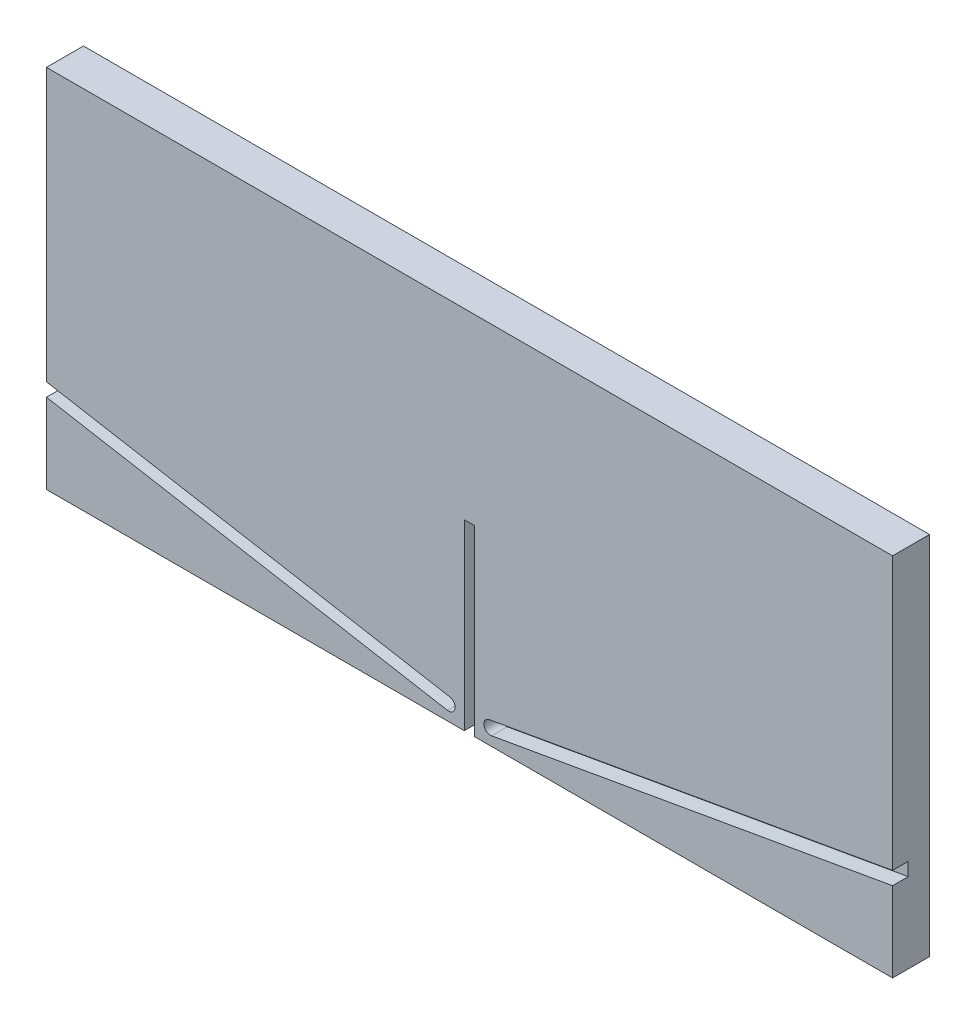
ISO-10303-21;
HEADER;
FILE_DESCRIPTION(('STEP AP214'),'2;1');
FILE_NAME('part.step','',(''),(''),'','','');
FILE_SCHEMA(('AUTOMOTIVE_DESIGN { 1 0 10303 214 1 1 1 1 }'));
ENDSEC;
DATA;
#1=APPLICATION_CONTEXT('core data for automotive mechanical design processes');
#2=APPLICATION_PROTOCOL_DEFINITION('international standard','automotive_design',2000,#1);
#3=PRODUCT_CONTEXT('',#1,'mechanical');
#4=PRODUCT('Part','Part','',(#3));
#5=PRODUCT_RELATED_PRODUCT_CATEGORY('part','',(#4));
#6=PRODUCT_DEFINITION_FORMATION('','',#4);
#7=PRODUCT_DEFINITION_CONTEXT('part definition',#1,'design');
#8=PRODUCT_DEFINITION('design','',#6,#7);
#9=PRODUCT_DEFINITION_SHAPE('','',#8);
#10=(LENGTH_UNIT() NAMED_UNIT(*) SI_UNIT(.MILLI.,.METRE.));
#11=(NAMED_UNIT(*) PLANE_ANGLE_UNIT() SI_UNIT($,.RADIAN.));
#12=(NAMED_UNIT(*) SI_UNIT($,.STERADIAN.) SOLID_ANGLE_UNIT());
#13=UNCERTAINTY_MEASURE_WITH_UNIT(LENGTH_MEASURE(1.E-05),#10,'distance_accuracy_value','');
#14=(GEOMETRIC_REPRESENTATION_CONTEXT(3) GLOBAL_UNCERTAINTY_ASSIGNED_CONTEXT((#13)) GLOBAL_UNIT_ASSIGNED_CONTEXT((#10,
#11,#12)) REPRESENTATION_CONTEXT('',''));
#15=CARTESIAN_POINT('',(0.,0.,0.));
#16=DIRECTION('',(0.,0.,1.));
#17=DIRECTION('',(1.,0.,0.));
#18=AXIS2_PLACEMENT_3D('',#15,#16,#17);
#19=CARTESIAN_POINT('',(-102.87,-44.45,8.9916));
#20=DIRECTION('',(0.,1.,0.));
#21=DIRECTION('',(0.,0.,1.));
#22=AXIS2_PLACEMENT_3D('',#19,#20,#21);
#23=PLANE('',#22);
#24=DIRECTION('',(1.,0.,0.));
#25=VECTOR('',#24,1.);
#26=CARTESIAN_POINT('',(-102.87,-44.45,0.));
#27=LINE('',#26,#25);
#28=CARTESIAN_POINT('',(-102.87,-44.45,0.));
#29=VERTEX_POINT('',#28);
#30=CARTESIAN_POINT('',(-1.26999999999997,-44.45,0.));
#31=VERTEX_POINT('',#30);
#32=EDGE_CURVE('E254',#29,#31,#27,.T.);
#33=ORIENTED_EDGE('',*,*,#32,.T.);
#34=DIRECTION('',(0.,0.,1.));
#35=VECTOR('',#34,1.);
#36=CARTESIAN_POINT('',(-1.26999999999997,-44.45,0.));
#37=LINE('',#36,#35);
#38=CARTESIAN_POINT('',(-1.26999999999997,-44.45,8.9916));
#39=VERTEX_POINT('',#38);
#40=EDGE_CURVE('E215',#31,#39,#37,.T.);
#41=ORIENTED_EDGE('',*,*,#40,.T.);
#42=DIRECTION('',(1.,0.,0.));
#43=VECTOR('',#42,1.);
#44=CARTESIAN_POINT('',(-102.87,-44.45,8.9916));
#45=LINE('',#44,#43);
#46=CARTESIAN_POINT('',(-102.87,-44.45,8.9916));
#47=VERTEX_POINT('',#46);
#48=EDGE_CURVE('E243',#47,#39,#45,.T.);
#49=ORIENTED_EDGE('',*,*,#48,.F.);
#50=DIRECTION('',(0.,0.,-1.));
#51=VECTOR('',#50,1.);
#52=CARTESIAN_POINT('',(-102.87,-44.45,8.9916));
#53=LINE('',#52,#51);
#54=EDGE_CURVE('E259',#47,#29,#53,.T.);
#55=ORIENTED_EDGE('',*,*,#54,.T.);
#56=EDGE_LOOP('',(#33,#41,#49,#55));
#57=FACE_BOUND('',#56,.T.);
#58=ADVANCED_FACE('F35',(#57),#23,.F.);
#59=CARTESIAN_POINT('',(102.87,-44.45,8.9916));
#60=DIRECTION('',(-1.,0.,0.));
#61=DIRECTION('',(0.,0.,1.));
#62=AXIS2_PLACEMENT_3D('',#59,#60,#61);
#63=PLANE('',#62);
#64=DIRECTION('',(0.,-1.,0.));
#65=VECTOR('',#64,1.);
#66=CARTESIAN_POINT('',(102.87,-44.45,5.1816));
#67=LINE('',#66,#65);
#68=CARTESIAN_POINT('',(102.87,-21.7849948101507,5.1816));
#69=VERTEX_POINT('',#68);
#70=CARTESIAN_POINT('',(102.87,-25.0089743028879,5.1816));
#71=VERTEX_POINT('',#70);
#72=EDGE_CURVE('E11',#69,#71,#67,.T.);
#73=ORIENTED_EDGE('',*,*,#72,.T.);
#74=DIRECTION('',(0.,0.,1.));
#75=VECTOR('',#74,1.);
#76=CARTESIAN_POINT('',(102.87,-25.0089743028879,8.9916));
#77=LINE('',#76,#75);
#78=CARTESIAN_POINT('',(102.87,-25.0089743028879,8.9916));
#79=VERTEX_POINT('',#78);
#80=EDGE_CURVE('E177',#71,#79,#77,.T.);
#81=ORIENTED_EDGE('',*,*,#80,.T.);
#82=DIRECTION('',(0.,1.,0.));
#83=VECTOR('',#82,1.);
#84=CARTESIAN_POINT('',(102.87,-44.45,8.9916));
#85=LINE('',#84,#83);
#86=CARTESIAN_POINT('',(102.87,-44.45,8.9916));
#87=VERTEX_POINT('',#86);
#88=EDGE_CURVE('E231',#87,#79,#85,.T.);
#89=ORIENTED_EDGE('',*,*,#88,.F.);
#90=DIRECTION('',(0.,0.,-1.));
#91=VECTOR('',#90,1.);
#92=CARTESIAN_POINT('',(102.87,-44.45,8.9916));
#93=LINE('',#92,#91);
#94=CARTESIAN_POINT('',(102.87,-44.45,0.));
#95=VERTEX_POINT('',#94);
#96=EDGE_CURVE('E246',#87,#95,#93,.T.);
#97=ORIENTED_EDGE('',*,*,#96,.T.);
#98=DIRECTION('',(0.,1.,0.));
#99=VECTOR('',#98,1.);
#100=CARTESIAN_POINT('',(102.87,-44.45,0.));
#101=LINE('',#100,#99);
#102=CARTESIAN_POINT('',(102.87,44.45,0.));
#103=VERTEX_POINT('',#102);
#104=EDGE_CURVE('E224',#95,#103,#101,.T.);
#105=ORIENTED_EDGE('',*,*,#104,.T.);
#106=DIRECTION('',(0.,0.,-1.));
#107=VECTOR('',#106,1.);
#108=CARTESIAN_POINT('',(102.87,44.45,8.9916));
#109=LINE('',#108,#107);
#110=CARTESIAN_POINT('',(102.87,44.45,8.9916));
#111=VERTEX_POINT('',#110);
#112=EDGE_CURVE('E265',#111,#103,#109,.T.);
#113=ORIENTED_EDGE('',*,*,#112,.F.);
#114=CARTESIAN_POINT('',(102.87,-21.7849948101507,8.9916));
#115=VERTEX_POINT('',#114);
#116=EDGE_CURVE('E235',#115,#111,#85,.T.);
#117=ORIENTED_EDGE('',*,*,#116,.F.);
#118=DIRECTION('',(0.,0.,-1.));
#119=VECTOR('',#118,1.);
#120=CARTESIAN_POINT('',(102.87,-21.7849948101507,8.9916));
#121=LINE('',#120,#119);
#122=EDGE_CURVE('E50',#115,#69,#121,.T.);
#123=ORIENTED_EDGE('',*,*,#122,.T.);
#124=EDGE_LOOP('',(#73,#81,#89,#97,#105,#113,#117,#123));
#125=FACE_BOUND('',#124,.T.);
#126=ADVANCED_FACE('F37',(#125),#63,.F.);
#127=CARTESIAN_POINT('',(-102.87,44.45,8.9916));
#128=DIRECTION('',(0.,-1.,0.));
#129=DIRECTION('',(0.,0.,-1.));
#130=AXIS2_PLACEMENT_3D('',#127,#128,#129);
#131=PLANE('',#130);
#132=DIRECTION('',(-1.,0.,0.));
#133=VECTOR('',#132,1.);
#134=CARTESIAN_POINT('',(-102.87,44.45,0.));
#135=LINE('',#134,#133);
#136=CARTESIAN_POINT('',(-102.87,44.45,0.));
#137=VERTEX_POINT('',#136);
#138=EDGE_CURVE('E249',#103,#137,#135,.T.);
#139=ORIENTED_EDGE('',*,*,#138,.T.);
#140=DIRECTION('',(0.,0.,-1.));
#141=VECTOR('',#140,1.);
#142=CARTESIAN_POINT('',(-102.87,44.45,8.9916));
#143=LINE('',#142,#141);
#144=CARTESIAN_POINT('',(-102.87,44.45,8.9916));
#145=VERTEX_POINT('',#144);
#146=EDGE_CURVE('E262',#145,#137,#143,.T.);
#147=ORIENTED_EDGE('',*,*,#146,.F.);
#148=DIRECTION('',(-1.,0.,0.));
#149=VECTOR('',#148,1.);
#150=CARTESIAN_POINT('',(-102.87,44.45,8.9916));
#151=LINE('',#150,#149);
#152=EDGE_CURVE('E234',#111,#145,#151,.T.);
#153=ORIENTED_EDGE('',*,*,#152,.F.);
#154=ORIENTED_EDGE('',*,*,#112,.T.);
#155=EDGE_LOOP('',(#139,#147,#153,#154));
#156=FACE_BOUND('',#155,.T.);
#157=ADVANCED_FACE('F280',(#156),#131,.F.);
#158=CARTESIAN_POINT('',(-102.87,-44.45,8.9916));
#159=DIRECTION('',(1.,0.,0.));
#160=DIRECTION('',(0.,0.,-1.));
#161=AXIS2_PLACEMENT_3D('',#158,#159,#160);
#162=PLANE('',#161);
#163=DIRECTION('',(0.,-1.,0.));
#164=VECTOR('',#163,1.);
#165=CARTESIAN_POINT('',(-102.87,-44.45,5.1816));
#166=LINE('',#165,#164);
#167=CARTESIAN_POINT('',(-102.87,-21.7849948101506,5.1816));
#168=VERTEX_POINT('',#167);
#169=CARTESIAN_POINT('',(-102.87,-25.0089743028878,5.1816));
#170=VERTEX_POINT('',#169);
#171=EDGE_CURVE('E270',#168,#170,#166,.T.);
#172=ORIENTED_EDGE('',*,*,#171,.F.);
#173=DIRECTION('',(0.,0.,1.));
#174=VECTOR('',#173,1.);
#175=CARTESIAN_POINT('',(-102.87,-21.7849948101506,8.9916));
#176=LINE('',#175,#174);
#177=CARTESIAN_POINT('',(-102.87,-21.7849948101506,8.9916));
#178=VERTEX_POINT('',#177);
#179=EDGE_CURVE('E201',#168,#178,#176,.T.);
#180=ORIENTED_EDGE('',*,*,#179,.T.);
#181=DIRECTION('',(0.,-1.,0.));
#182=VECTOR('',#181,1.);
#183=CARTESIAN_POINT('',(-102.87,-44.45,8.9916));
#184=LINE('',#183,#182);
#185=EDGE_CURVE('E238',#145,#178,#184,.T.);
#186=ORIENTED_EDGE('',*,*,#185,.F.);
#187=ORIENTED_EDGE('',*,*,#146,.T.);
#188=DIRECTION('',(0.,-1.,0.));
#189=VECTOR('',#188,1.);
#190=CARTESIAN_POINT('',(-102.87,-44.45,0.));
#191=LINE('',#190,#189);
#192=EDGE_CURVE('E251',#137,#29,#191,.T.);
#193=ORIENTED_EDGE('',*,*,#192,.T.);
#194=ORIENTED_EDGE('',*,*,#54,.F.);
#195=CARTESIAN_POINT('',(-102.87,-25.0089743028878,8.9916));
#196=VERTEX_POINT('',#195);
#197=EDGE_CURVE('E237',#196,#47,#184,.T.);
#198=ORIENTED_EDGE('',*,*,#197,.F.);
#199=DIRECTION('',(0.,0.,-1.));
#200=VECTOR('',#199,1.);
#201=CARTESIAN_POINT('',(-102.87,-25.0089743028878,8.9916));
#202=LINE('',#201,#200);
#203=EDGE_CURVE('E58',#196,#170,#202,.T.);
#204=ORIENTED_EDGE('',*,*,#203,.T.);
#205=EDGE_LOOP('',(#172,#180,#186,#187,#193,#194,#198,#204));
#206=FACE_BOUND('',#205,.T.);
#207=ADVANCED_FACE('F287',(#206),#162,.F.);
#208=CARTESIAN_POINT('',(1.27000000000002,-44.45,8.9916));
#209=VERTEX_POINT('',#208);
#210=EDGE_CURVE('E242',#209,#87,#45,.T.);
#211=ORIENTED_EDGE('',*,*,#210,.F.);
#212=DIRECTION('',(0.,0.,1.));
#213=VECTOR('',#212,1.);
#214=CARTESIAN_POINT('',(1.27000000000002,-44.45,0.));
#215=LINE('',#214,#213);
#216=CARTESIAN_POINT('',(1.27000000000002,-44.45,0.));
#217=VERTEX_POINT('',#216);
#218=EDGE_CURVE('E227',#217,#209,#215,.T.);
#219=ORIENTED_EDGE('',*,*,#218,.F.);
#220=EDGE_CURVE('E253',#217,#95,#27,.T.);
#221=ORIENTED_EDGE('',*,*,#220,.T.);
#222=ORIENTED_EDGE('',*,*,#96,.F.);
#223=EDGE_LOOP('',(#211,#219,#221,#222));
#224=FACE_BOUND('',#223,.T.);
#225=ADVANCED_FACE('F318',(#224),#23,.F.);
#226=CARTESIAN_POINT('',(0.,0.,8.9916));
#227=DIRECTION('',(0.,0.,-1.));
#228=DIRECTION('',(-1.,0.,0.));
#229=AXIS2_PLACEMENT_3D('',#226,#227,#228);
#230=PLANE('',#229);
#231=ORIENTED_EDGE('',*,*,#88,.T.);
#232=DIRECTION('',(0.984807753012208,0.173648177666929,0.));
#233=VECTOR('',#232,1.);
#234=CARTESIAN_POINT('',(200.935666482046,-7.71735142094551,8.9916));
#235=LINE('',#234,#233);
#236=CARTESIAN_POINT('',(5.35566648204597,-42.2033823079069,8.9916));
#237=VERTEX_POINT('',#236);
#238=EDGE_CURVE('E156',#237,#79,#235,.T.);
#239=ORIENTED_EDGE('',*,*,#238,.F.);
#240=CARTESIAN_POINT('',(5.07999999999973,-40.64,8.9916));
#241=DIRECTION('',(0.,0.,1.));
#242=DIRECTION('',(-1.,0.,0.));
#243=AXIS2_PLACEMENT_3D('',#240,#241,#242);
#244=CIRCLE('',#243,1.58750000000001);
#245=CARTESIAN_POINT('',(4.80433351795349,-39.0766176920931,8.9916));
#246=VERTEX_POINT('',#245);
#247=EDGE_CURVE('E171',#246,#237,#244,.T.);
#248=ORIENTED_EDGE('',*,*,#247,.F.);
#249=DIRECTION('',(0.984807753012208,0.173648177666929,0.));
#250=VECTOR('',#249,1.);
#251=CARTESIAN_POINT('',(6.82736357353507,-38.7199029105099,8.9916));
#252=LINE('',#251,#250);
#253=EDGE_CURVE('E43',#246,#115,#252,.T.);
#254=ORIENTED_EDGE('',*,*,#253,.T.);
#255=ORIENTED_EDGE('',*,*,#116,.T.);
#256=ORIENTED_EDGE('',*,*,#152,.T.);
#257=ORIENTED_EDGE('',*,*,#185,.T.);
#258=DIRECTION('',(-0.984807753012208,0.17364817766693,0.));
#259=VECTOR('',#258,1.);
#260=CARTESIAN_POINT('',(-200.384333517954,-4.59058680513148,8.9916));
#261=LINE('',#260,#259);
#262=CARTESIAN_POINT('',(-4.80433351795353,-39.0766176920931,8.9916));
#263=VERTEX_POINT('',#262);
#264=EDGE_CURVE('E184',#263,#178,#261,.T.);
#265=ORIENTED_EDGE('',*,*,#264,.F.);
#266=CARTESIAN_POINT('',(-5.07999999999978,-40.64,8.9916));
#267=DIRECTION('',(0.,0.,1.));
#268=DIRECTION('',(1.,0.,0.));
#269=AXIS2_PLACEMENT_3D('',#266,#267,#268);
#270=CIRCLE('',#269,1.58750000000001);
#271=CARTESIAN_POINT('',(-5.35566648204602,-42.2033823079069,8.9916));
#272=VERTEX_POINT('',#271);
#273=EDGE_CURVE('E180',#272,#263,#270,.T.);
#274=ORIENTED_EDGE('',*,*,#273,.F.);
#275=DIRECTION('',(-0.984807753012208,0.17364817766693,0.));
#276=VECTOR('',#275,1.);
#277=CARTESIAN_POINT('',(-7.37869653762763,-41.8466675263237,8.9916));
#278=LINE('',#277,#276);
#279=EDGE_CURVE('E268',#272,#196,#278,.T.);
#280=ORIENTED_EDGE('',*,*,#279,.T.);
#281=ORIENTED_EDGE('',*,*,#197,.T.);
#282=ORIENTED_EDGE('',*,*,#48,.T.);
#283=DIRECTION('',(0.,-1.,0.));
#284=VECTOR('',#283,1.);
#285=CARTESIAN_POINT('',(-1.26999999999998,0.,8.9916));
#286=LINE('',#285,#284);
#287=CARTESIAN_POINT('',(-1.26999999999998,0.,8.9916));
#288=VERTEX_POINT('',#287);
#289=EDGE_CURVE('E204',#288,#39,#286,.T.);
#290=ORIENTED_EDGE('',*,*,#289,.F.);
#291=DIRECTION('',(-1.,0.,0.));
#292=VECTOR('',#291,1.);
#293=CARTESIAN_POINT('',(-1.26999999999998,0.,8.9916));
#294=LINE('',#293,#292);
#295=CARTESIAN_POINT('',(1.27000000000002,0.,8.9916));
#296=VERTEX_POINT('',#295);
#297=EDGE_CURVE('E209',#296,#288,#294,.T.);
#298=ORIENTED_EDGE('',*,*,#297,.F.);
#299=DIRECTION('',(0.,1.,0.));
#300=VECTOR('',#299,1.);
#301=CARTESIAN_POINT('',(1.27000000000002,0.,8.9916));
#302=LINE('',#301,#300);
#303=EDGE_CURVE('E217',#209,#296,#302,.T.);
#304=ORIENTED_EDGE('',*,*,#303,.F.);
#305=ORIENTED_EDGE('',*,*,#210,.T.);
#306=EDGE_LOOP('',(#231,#239,#248,#254,#255,#256,#257,#265,#274,#280,#281,#282,#290,#298,#304,#305));
#307=FACE_BOUND('',#306,.T.);
#308=ADVANCED_FACE('F273',(#307),#230,.F.);
#309=CARTESIAN_POINT('',(0.,0.,0.));
#310=DIRECTION('',(0.,0.,-1.));
#311=DIRECTION('',(-1.,0.,0.));
#312=AXIS2_PLACEMENT_3D('',#309,#310,#311);
#313=PLANE('',#312);
#314=DIRECTION('',(0.,-1.,0.));
#315=VECTOR('',#314,1.);
#316=CARTESIAN_POINT('',(-1.26999999999998,0.,0.));
#317=LINE('',#316,#315);
#318=CARTESIAN_POINT('',(-1.26999999999998,0.,0.));
#319=VERTEX_POINT('',#318);
#320=EDGE_CURVE('E205',#319,#31,#317,.T.);
#321=ORIENTED_EDGE('',*,*,#320,.T.);
#322=ORIENTED_EDGE('',*,*,#32,.F.);
#323=ORIENTED_EDGE('',*,*,#192,.F.);
#324=ORIENTED_EDGE('',*,*,#138,.F.);
#325=ORIENTED_EDGE('',*,*,#104,.F.);
#326=ORIENTED_EDGE('',*,*,#220,.F.);
#327=DIRECTION('',(0.,1.,0.));
#328=VECTOR('',#327,1.);
#329=CARTESIAN_POINT('',(1.27000000000002,0.,0.));
#330=LINE('',#329,#328);
#331=CARTESIAN_POINT('',(1.27000000000002,0.,0.));
#332=VERTEX_POINT('',#331);
#333=EDGE_CURVE('E208',#217,#332,#330,.T.);
#334=ORIENTED_EDGE('',*,*,#333,.T.);
#335=DIRECTION('',(-1.,0.,0.));
#336=VECTOR('',#335,1.);
#337=CARTESIAN_POINT('',(-1.26999999999998,0.,0.));
#338=LINE('',#337,#336);
#339=EDGE_CURVE('E212',#332,#319,#338,.T.);
#340=ORIENTED_EDGE('',*,*,#339,.T.);
#341=EDGE_LOOP('',(#321,#322,#323,#324,#325,#326,#334,#340));
#342=FACE_BOUND('',#341,.T.);
#343=ADVANCED_FACE('F344',(#342),#313,.T.);
#344=CARTESIAN_POINT('',(-1.26999999999998,0.,0.));
#345=DIRECTION('',(-1.,0.,0.));
#346=DIRECTION('',(0.,-1.,0.));
#347=AXIS2_PLACEMENT_3D('',#344,#345,#346);
#348=PLANE('',#347);
#349=ORIENTED_EDGE('',*,*,#289,.T.);
#350=ORIENTED_EDGE('',*,*,#40,.F.);
#351=ORIENTED_EDGE('',*,*,#320,.F.);
#352=DIRECTION('',(0.,0.,1.));
#353=VECTOR('',#352,1.);
#354=CARTESIAN_POINT('',(-1.26999999999998,0.,0.));
#355=LINE('',#354,#353);
#356=EDGE_CURVE('E222',#319,#288,#355,.T.);
#357=ORIENTED_EDGE('',*,*,#356,.T.);
#358=EDGE_LOOP('',(#349,#350,#351,#357));
#359=FACE_BOUND('',#358,.T.);
#360=ADVANCED_FACE('F307',(#359),#348,.F.);
#361=CARTESIAN_POINT('',(-1.26999999999998,0.,0.));
#362=DIRECTION('',(0.,1.,0.));
#363=DIRECTION('',(0.,0.,1.));
#364=AXIS2_PLACEMENT_3D('',#361,#362,#363);
#365=PLANE('',#364);
#366=ORIENTED_EDGE('',*,*,#297,.T.);
#367=ORIENTED_EDGE('',*,*,#356,.F.);
#368=ORIENTED_EDGE('',*,*,#339,.F.);
#369=DIRECTION('',(0.,0.,1.));
#370=VECTOR('',#369,1.);
#371=CARTESIAN_POINT('',(1.27000000000002,0.,0.));
#372=LINE('',#371,#370);
#373=EDGE_CURVE('E225',#332,#296,#372,.T.);
#374=ORIENTED_EDGE('',*,*,#373,.T.);
#375=EDGE_LOOP('',(#366,#367,#368,#374));
#376=FACE_BOUND('',#375,.T.);
#377=ADVANCED_FACE('F310',(#376),#365,.F.);
#378=CARTESIAN_POINT('',(1.27000000000002,0.,0.));
#379=DIRECTION('',(1.,0.,0.));
#380=DIRECTION('',(0.,1.,0.));
#381=AXIS2_PLACEMENT_3D('',#378,#379,#380);
#382=PLANE('',#381);
#383=ORIENTED_EDGE('',*,*,#303,.T.);
#384=ORIENTED_EDGE('',*,*,#373,.F.);
#385=ORIENTED_EDGE('',*,*,#333,.F.);
#386=ORIENTED_EDGE('',*,*,#218,.T.);
#387=EDGE_LOOP('',(#383,#384,#385,#386));
#388=FACE_BOUND('',#387,.T.);
#389=ADVANCED_FACE('F313',(#388),#382,.F.);
#390=CARTESIAN_POINT('',(-200.66,-6.15396911303838,5.1816));
#391=DIRECTION('',(0.,0.,1.));
#392=DIRECTION('',(1.,0.,0.));
#393=AXIS2_PLACEMENT_3D('',#390,#391,#392);
#394=PLANE('',#393);
#395=ORIENTED_EDGE('',*,*,#171,.T.);
#396=DIRECTION('',(0.984807753012208,-0.17364817766693,0.));
#397=VECTOR('',#396,1.);
#398=CARTESIAN_POINT('',(-200.935666482046,-7.71735142094526,5.1816));
#399=LINE('',#398,#397);
#400=CARTESIAN_POINT('',(-5.35566648204602,-42.2033823079069,5.1816));
#401=VERTEX_POINT('',#400);
#402=EDGE_CURVE('E181',#170,#401,#399,.T.);
#403=ORIENTED_EDGE('',*,*,#402,.T.);
#404=CARTESIAN_POINT('',(-5.07999999999978,-40.64,5.1816));
#405=DIRECTION('',(0.,0.,1.));
#406=DIRECTION('',(1.,0.,0.));
#407=AXIS2_PLACEMENT_3D('',#404,#405,#406);
#408=CIRCLE('',#407,1.58750000000001);
#409=CARTESIAN_POINT('',(-4.80433351795353,-39.0766176920931,5.1816));
#410=VERTEX_POINT('',#409);
#411=EDGE_CURVE('E183',#401,#410,#408,.T.);
#412=ORIENTED_EDGE('',*,*,#411,.T.);
#413=DIRECTION('',(-0.984807753012208,0.17364817766693,0.));
#414=VECTOR('',#413,1.);
#415=CARTESIAN_POINT('',(-200.384333517954,-4.59058680513148,5.1816));
#416=LINE('',#415,#414);
#417=EDGE_CURVE('E187',#410,#168,#416,.T.);
#418=ORIENTED_EDGE('',*,*,#417,.T.);
#419=EDGE_LOOP('',(#395,#403,#412,#418));
#420=FACE_BOUND('',#419,.T.);
#421=ADVANCED_FACE('F293',(#420),#394,.T.);
#422=CARTESIAN_POINT('',(-200.384333517954,-4.59058680513148,5.1816));
#423=DIRECTION('',(0.17364817766693,0.984807753012208,0.));
#424=DIRECTION('',(-0.984807753012208,0.17364817766693,0.));
#425=AXIS2_PLACEMENT_3D('',#422,#423,#424);
#426=PLANE('',#425);
#427=ORIENTED_EDGE('',*,*,#417,.F.);
#428=DIRECTION('',(0.,0.,1.));
#429=VECTOR('',#428,1.);
#430=CARTESIAN_POINT('',(-4.80433351795353,-39.0766176920931,5.1816));
#431=LINE('',#430,#429);
#432=EDGE_CURVE('E194',#410,#263,#431,.T.);
#433=ORIENTED_EDGE('',*,*,#432,.T.);
#434=ORIENTED_EDGE('',*,*,#264,.T.);
#435=ORIENTED_EDGE('',*,*,#179,.F.);
#436=EDGE_LOOP('',(#427,#433,#434,#435));
#437=FACE_BOUND('',#436,.T.);
#438=ADVANCED_FACE('F291',(#437),#426,.F.);
#439=CARTESIAN_POINT('',(-200.935666482046,-7.71735142094526,5.1816));
#440=DIRECTION('',(-0.17364817766693,-0.984807753012208,0.));
#441=DIRECTION('',(0.984807753012208,-0.17364817766693,0.));
#442=AXIS2_PLACEMENT_3D('',#439,#440,#441);
#443=PLANE('',#442);
#444=ORIENTED_EDGE('',*,*,#279,.F.);
#445=DIRECTION('',(0.,0.,1.));
#446=VECTOR('',#445,1.);
#447=CARTESIAN_POINT('',(-5.35566648204602,-42.2033823079069,5.1816));
#448=LINE('',#447,#446);
#449=EDGE_CURVE('E190',#401,#272,#448,.T.);
#450=ORIENTED_EDGE('',*,*,#449,.F.);
#451=ORIENTED_EDGE('',*,*,#402,.F.);
#452=ORIENTED_EDGE('',*,*,#203,.F.);
#453=EDGE_LOOP('',(#444,#450,#451,#452));
#454=FACE_BOUND('',#453,.T.);
#455=ADVANCED_FACE('F392',(#454),#443,.F.);
#456=CARTESIAN_POINT('',(-5.07999999999978,-40.64,5.1816));
#457=DIRECTION('',(0.,0.,1.));
#458=DIRECTION('',(1.,0.,0.));
#459=AXIS2_PLACEMENT_3D('',#456,#457,#458);
#460=CYLINDRICAL_SURFACE('',#459,1.58750000000001);
#461=ORIENTED_EDGE('',*,*,#273,.T.);
#462=ORIENTED_EDGE('',*,*,#432,.F.);
#463=ORIENTED_EDGE('',*,*,#411,.F.);
#464=ORIENTED_EDGE('',*,*,#449,.T.);
#465=EDGE_LOOP('',(#461,#462,#463,#464));
#466=FACE_BOUND('',#465,.T.);
#467=ADVANCED_FACE('F297',(#466),#460,.F.);
#468=CARTESIAN_POINT('',(200.66,-6.15396911303863,5.1816));
#469=DIRECTION('',(0.,0.,-1.));
#470=DIRECTION('',(-1.,0.,0.));
#471=AXIS2_PLACEMENT_3D('',#468,#469,#470);
#472=PLANE('',#471);
#473=DIRECTION('',(-0.984807753012208,-0.173648177666929,0.));
#474=VECTOR('',#473,1.);
#475=CARTESIAN_POINT('',(200.384333517954,-4.59058680513173,5.1816));
#476=LINE('',#475,#474);
#477=CARTESIAN_POINT('',(4.80433351795349,-39.0766176920931,5.1816));
#478=VERTEX_POINT('',#477);
#479=EDGE_CURVE('E149',#69,#478,#476,.T.);
#480=ORIENTED_EDGE('',*,*,#479,.T.);
#481=CARTESIAN_POINT('',(5.07999999999973,-40.64,5.1816));
#482=DIRECTION('',(0.,0.,1.));
#483=DIRECTION('',(-1.,0.,0.));
#484=AXIS2_PLACEMENT_3D('',#481,#482,#483);
#485=CIRCLE('',#484,1.58750000000001);
#486=CARTESIAN_POINT('',(5.35566648204597,-42.2033823079069,5.1816));
#487=VERTEX_POINT('',#486);
#488=EDGE_CURVE('E154',#478,#487,#485,.T.);
#489=ORIENTED_EDGE('',*,*,#488,.T.);
#490=DIRECTION('',(0.984807753012208,0.173648177666929,0.));
#491=VECTOR('',#490,1.);
#492=CARTESIAN_POINT('',(200.935666482046,-7.71735142094551,5.1816));
#493=LINE('',#492,#491);
#494=EDGE_CURVE('E165',#487,#71,#493,.T.);
#495=ORIENTED_EDGE('',*,*,#494,.T.);
#496=ORIENTED_EDGE('',*,*,#72,.F.);
#497=EDGE_LOOP('',(#480,#489,#495,#496));
#498=FACE_BOUND('',#497,.T.);
#499=ADVANCED_FACE('F151',(#498),#472,.F.);
#500=CARTESIAN_POINT('',(200.935666482046,-7.71735142094551,5.1816));
#501=DIRECTION('',(0.173648177666929,-0.984807753012208,0.));
#502=DIRECTION('',(0.984807753012208,0.173648177666929,0.));
#503=AXIS2_PLACEMENT_3D('',#500,#501,#502);
#504=PLANE('',#503);
#505=ORIENTED_EDGE('',*,*,#494,.F.);
#506=DIRECTION('',(0.,0.,1.));
#507=VECTOR('',#506,1.);
#508=CARTESIAN_POINT('',(5.35566648204597,-42.2033823079069,5.1816));
#509=LINE('',#508,#507);
#510=EDGE_CURVE('E164',#487,#237,#509,.T.);
#511=ORIENTED_EDGE('',*,*,#510,.T.);
#512=ORIENTED_EDGE('',*,*,#238,.T.);
#513=ORIENTED_EDGE('',*,*,#80,.F.);
#514=EDGE_LOOP('',(#505,#511,#512,#513));
#515=FACE_BOUND('',#514,.T.);
#516=ADVANCED_FACE('F322',(#515),#504,.F.);
#517=CARTESIAN_POINT('',(200.384333517954,-4.59058680513173,5.1816));
#518=DIRECTION('',(-0.173648177666929,0.984807753012208,0.));
#519=DIRECTION('',(-0.984807753012208,-0.173648177666929,0.));
#520=AXIS2_PLACEMENT_3D('',#517,#518,#519);
#521=PLANE('',#520);
#522=ORIENTED_EDGE('',*,*,#253,.F.);
#523=DIRECTION('',(0.,0.,1.));
#524=VECTOR('',#523,1.);
#525=CARTESIAN_POINT('',(4.80433351795349,-39.0766176920931,5.1816));
#526=LINE('',#525,#524);
#527=EDGE_CURVE('E159',#478,#246,#526,.T.);
#528=ORIENTED_EDGE('',*,*,#527,.F.);
#529=ORIENTED_EDGE('',*,*,#479,.F.);
#530=ORIENTED_EDGE('',*,*,#122,.F.);
#531=EDGE_LOOP('',(#522,#528,#529,#530));
#532=FACE_BOUND('',#531,.T.);
#533=ADVANCED_FACE('F160',(#532),#521,.F.);
#534=CARTESIAN_POINT('',(5.07999999999973,-40.64,5.1816));
#535=DIRECTION('',(0.,0.,1.));
#536=DIRECTION('',(1.,0.,0.));
#537=AXIS2_PLACEMENT_3D('',#534,#535,#536);
#538=CYLINDRICAL_SURFACE('',#537,1.58750000000001);
#539=ORIENTED_EDGE('',*,*,#247,.T.);
#540=ORIENTED_EDGE('',*,*,#510,.F.);
#541=ORIENTED_EDGE('',*,*,#488,.F.);
#542=ORIENTED_EDGE('',*,*,#527,.T.);
#543=EDGE_LOOP('',(#539,#540,#541,#542));
#544=FACE_BOUND('',#543,.T.);
#545=ADVANCED_FACE('F167',(#544),#538,.F.);
#546=CLOSED_SHELL('',(#58,#126,#157,#207,#225,#308,#343,#360,#377,#389,#421,#438,#455,#467,#499,
#516,#533,#545));
#547=MANIFOLD_SOLID_BREP('B2',#546);
#548=ADVANCED_BREP_SHAPE_REPRESENTATION('',(#18,#547),#14);
#549=SHAPE_DEFINITION_REPRESENTATION(#9,#548);
ENDSEC;
END-ISO-10303-21;
